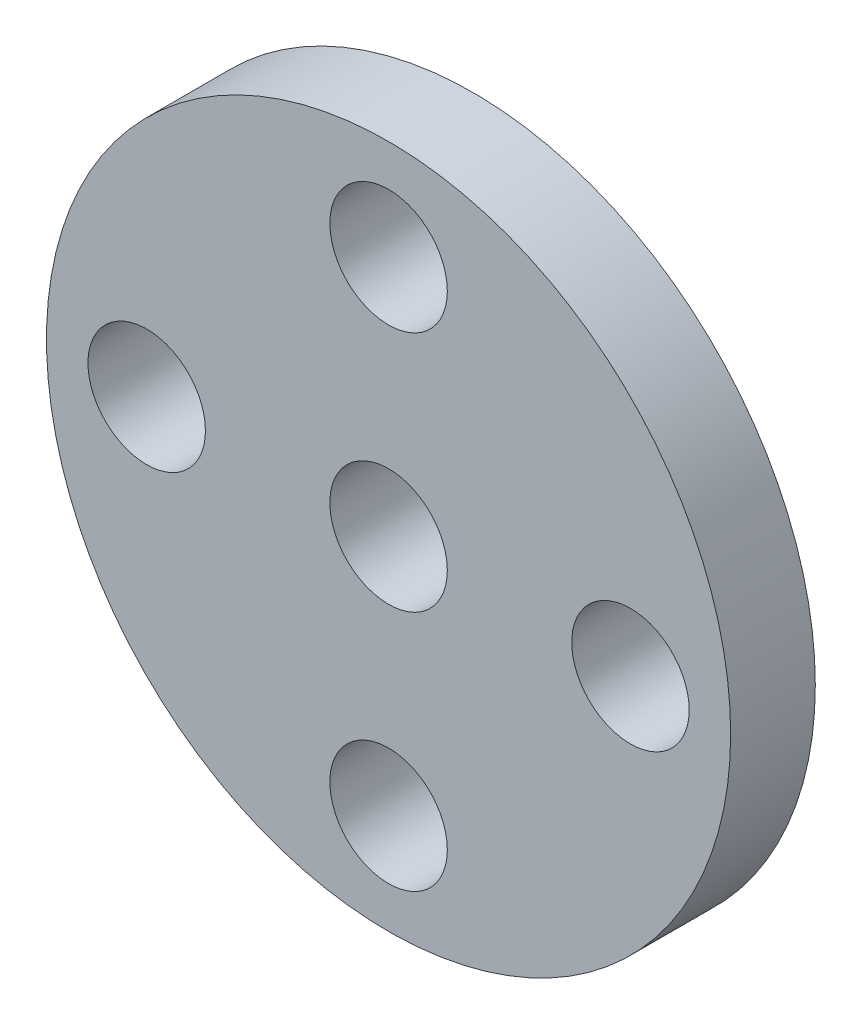
ISO-10303-21;
HEADER;
FILE_DESCRIPTION(('STEP AP214'),'2;1');
FILE_NAME('part.step','',(''),(''),'','','');
FILE_SCHEMA(('AUTOMOTIVE_DESIGN { 1 0 10303 214 1 1 1 1 }'));
ENDSEC;
DATA;
#1=APPLICATION_CONTEXT('core data for automotive mechanical design processes');
#2=APPLICATION_PROTOCOL_DEFINITION('international standard','automotive_design',2000,#1);
#3=PRODUCT_CONTEXT('',#1,'mechanical');
#4=PRODUCT('Part','Part','',(#3));
#5=PRODUCT_RELATED_PRODUCT_CATEGORY('part','',(#4));
#6=PRODUCT_DEFINITION_FORMATION('','',#4);
#7=PRODUCT_DEFINITION_CONTEXT('part definition',#1,'design');
#8=PRODUCT_DEFINITION('design','',#6,#7);
#9=PRODUCT_DEFINITION_SHAPE('','',#8);
#10=(LENGTH_UNIT() NAMED_UNIT(*) SI_UNIT(.MILLI.,.METRE.));
#11=(NAMED_UNIT(*) PLANE_ANGLE_UNIT() SI_UNIT($,.RADIAN.));
#12=(NAMED_UNIT(*) SI_UNIT($,.STERADIAN.) SOLID_ANGLE_UNIT());
#13=UNCERTAINTY_MEASURE_WITH_UNIT(LENGTH_MEASURE(1.E-05),#10,'distance_accuracy_value','');
#14=(GEOMETRIC_REPRESENTATION_CONTEXT(3) GLOBAL_UNCERTAINTY_ASSIGNED_CONTEXT((#13)) GLOBAL_UNIT_ASSIGNED_CONTEXT((#10,
#11,#12)) REPRESENTATION_CONTEXT('',''));
#15=CARTESIAN_POINT('',(0.,0.,0.));
#16=DIRECTION('',(0.,0.,1.));
#17=DIRECTION('',(1.,0.,0.));
#18=AXIS2_PLACEMENT_3D('',#15,#16,#17);
#19=CARTESIAN_POINT('',(0.,0.,-2.45));
#20=DIRECTION('',(0.,0.,1.));
#21=DIRECTION('',(1.,0.,0.));
#22=AXIS2_PLACEMENT_3D('',#19,#20,#21);
#23=PLANE('',#22);
#24=CARTESIAN_POINT('',(19.5,0.,-2.45));
#25=DIRECTION('',(0.,0.,1.));
#26=DIRECTION('',(1.,0.,0.));
#27=AXIS2_PLACEMENT_3D('',#24,#25,#26);
#28=CIRCLE('',#27,1.7);
#29=CARTESIAN_POINT('',(21.2,0.,-2.45));
#30=VERTEX_POINT('',#29);
#31=EDGE_CURVE('E41',#30,#30,#28,.T.);
#32=ORIENTED_EDGE('',*,*,#31,.T.);
#33=EDGE_LOOP('',(#32));
#34=FACE_BOUND('',#33,.T.);
#35=CARTESIAN_POINT('',(19.5,0.,-2.45));
#36=DIRECTION('',(0.,0.,-1.));
#37=DIRECTION('',(-1.,0.,0.));
#38=AXIS2_PLACEMENT_3D('',#35,#36,#37);
#39=CIRCLE('',#38,2.00641572465379);
#40=CARTESIAN_POINT('',(17.4935842753462,0.,-2.45));
#41=VERTEX_POINT('',#40);
#42=EDGE_CURVE('E163',#41,#41,#39,.T.);
#43=ORIENTED_EDGE('',*,*,#42,.T.);
#44=EDGE_LOOP('',(#43));
#45=FACE_BOUND('',#44,.T.);
#46=ADVANCED_FACE('F34',(#34,#45),#23,.F.);
#47=CARTESIAN_POINT('',(19.5,0.,-2.45));
#48=DIRECTION('',(0.,0.,1.));
#49=DIRECTION('',(1.,0.,0.));
#50=AXIS2_PLACEMENT_3D('',#47,#48,#49);
#51=CYLINDRICAL_SURFACE('',#50,9.9);
#52=CARTESIAN_POINT('',(19.5,0.,-2.45));
#53=DIRECTION('',(0.,0.,1.));
#54=DIRECTION('',(1.,0.,0.));
#55=AXIS2_PLACEMENT_3D('',#52,#53,#54);
#56=CIRCLE('',#55,9.9);
#57=CARTESIAN_POINT('',(29.4,0.,-2.45));
#58=VERTEX_POINT('',#57);
#59=EDGE_CURVE('E45',#58,#58,#56,.T.);
#60=ORIENTED_EDGE('',*,*,#59,.T.);
#61=EDGE_LOOP('',(#60));
#62=FACE_BOUND('',#61,.T.);
#63=CARTESIAN_POINT('',(19.5,0.,0.));
#64=DIRECTION('',(0.,0.,1.));
#65=DIRECTION('',(1.,0.,0.));
#66=AXIS2_PLACEMENT_3D('',#63,#64,#65);
#67=CIRCLE('',#66,9.9);
#68=CARTESIAN_POINT('',(29.4,0.,0.));
#69=VERTEX_POINT('',#68);
#70=EDGE_CURVE('E67',#69,#69,#67,.T.);
#71=ORIENTED_EDGE('',*,*,#70,.F.);
#72=EDGE_LOOP('',(#71));
#73=FACE_BOUND('',#72,.T.);
#74=ADVANCED_FACE('F96',(#62,#73),#51,.T.);
#75=CARTESIAN_POINT('',(19.5,7.,-2.45));
#76=DIRECTION('',(0.,0.,1.));
#77=DIRECTION('',(1.,0.,0.));
#78=AXIS2_PLACEMENT_3D('',#75,#76,#77);
#79=CYLINDRICAL_SURFACE('',#78,1.7);
#80=CARTESIAN_POINT('',(19.5,7.,-2.45));
#81=DIRECTION('',(0.,0.,1.));
#82=DIRECTION('',(1.,0.,0.));
#83=AXIS2_PLACEMENT_3D('',#80,#81,#82);
#84=CIRCLE('',#83,1.7);
#85=CARTESIAN_POINT('',(21.2,7.,-2.45));
#86=VERTEX_POINT('',#85);
#87=EDGE_CURVE('E50',#86,#86,#84,.T.);
#88=ORIENTED_EDGE('',*,*,#87,.F.);
#89=EDGE_LOOP('',(#88));
#90=FACE_BOUND('',#89,.T.);
#91=CARTESIAN_POINT('',(19.5,7.,0.));
#92=DIRECTION('',(0.,0.,1.));
#93=DIRECTION('',(1.,0.,0.));
#94=AXIS2_PLACEMENT_3D('',#91,#92,#93);
#95=CIRCLE('',#94,1.7);
#96=CARTESIAN_POINT('',(21.2,7.,0.));
#97=VERTEX_POINT('',#96);
#98=EDGE_CURVE('E64',#97,#97,#95,.T.);
#99=ORIENTED_EDGE('',*,*,#98,.T.);
#100=EDGE_LOOP('',(#99));
#101=FACE_BOUND('',#100,.T.);
#102=ADVANCED_FACE('F92',(#90,#101),#79,.F.);
#103=CARTESIAN_POINT('',(26.5,0.,-2.45));
#104=DIRECTION('',(0.,0.,1.));
#105=DIRECTION('',(1.,0.,0.));
#106=AXIS2_PLACEMENT_3D('',#103,#104,#105);
#107=CYLINDRICAL_SURFACE('',#106,1.7);
#108=CARTESIAN_POINT('',(26.5,0.,-2.45));
#109=DIRECTION('',(0.,0.,1.));
#110=DIRECTION('',(1.,0.,0.));
#111=AXIS2_PLACEMENT_3D('',#108,#109,#110);
#112=CIRCLE('',#111,1.7);
#113=CARTESIAN_POINT('',(28.2,0.,-2.45));
#114=VERTEX_POINT('',#113);
#115=EDGE_CURVE('E80',#114,#114,#112,.T.);
#116=ORIENTED_EDGE('',*,*,#115,.F.);
#117=EDGE_LOOP('',(#116));
#118=FACE_BOUND('',#117,.T.);
#119=CARTESIAN_POINT('',(26.5,0.,0.));
#120=DIRECTION('',(0.,0.,1.));
#121=DIRECTION('',(1.,0.,0.));
#122=AXIS2_PLACEMENT_3D('',#119,#120,#121);
#123=CIRCLE('',#122,1.7);
#124=CARTESIAN_POINT('',(28.2,0.,0.));
#125=VERTEX_POINT('',#124);
#126=EDGE_CURVE('E61',#125,#125,#123,.T.);
#127=ORIENTED_EDGE('',*,*,#126,.T.);
#128=EDGE_LOOP('',(#127));
#129=FACE_BOUND('',#128,.T.);
#130=ADVANCED_FACE('F95',(#118,#129),#107,.F.);
#131=CARTESIAN_POINT('',(19.4999999999999,-7.,-2.45));
#132=DIRECTION('',(0.,0.,1.));
#133=DIRECTION('',(1.,0.,0.));
#134=AXIS2_PLACEMENT_3D('',#131,#132,#133);
#135=CYLINDRICAL_SURFACE('',#134,1.7);
#136=CARTESIAN_POINT('',(19.4999999999999,-7.,-2.45));
#137=DIRECTION('',(0.,0.,1.));
#138=DIRECTION('',(1.,0.,0.));
#139=AXIS2_PLACEMENT_3D('',#136,#137,#138);
#140=CIRCLE('',#139,1.7);
#141=CARTESIAN_POINT('',(21.1999999999999,-7.,-2.45));
#142=VERTEX_POINT('',#141);
#143=EDGE_CURVE('E75',#142,#142,#140,.T.);
#144=ORIENTED_EDGE('',*,*,#143,.F.);
#145=EDGE_LOOP('',(#144));
#146=FACE_BOUND('',#145,.T.);
#147=CARTESIAN_POINT('',(19.4999999999999,-7.,0.));
#148=DIRECTION('',(0.,0.,1.));
#149=DIRECTION('',(1.,0.,0.));
#150=AXIS2_PLACEMENT_3D('',#147,#148,#149);
#151=CIRCLE('',#150,1.7);
#152=CARTESIAN_POINT('',(21.1999999999999,-7.,0.));
#153=VERTEX_POINT('',#152);
#154=EDGE_CURVE('E57',#153,#153,#151,.T.);
#155=ORIENTED_EDGE('',*,*,#154,.T.);
#156=EDGE_LOOP('',(#155));
#157=FACE_BOUND('',#156,.T.);
#158=ADVANCED_FACE('F120',(#146,#157),#135,.F.);
#159=CARTESIAN_POINT('',(12.5,0.,-2.45));
#160=DIRECTION('',(0.,0.,1.));
#161=DIRECTION('',(1.,0.,0.));
#162=AXIS2_PLACEMENT_3D('',#159,#160,#161);
#163=CYLINDRICAL_SURFACE('',#162,1.7);
#164=CARTESIAN_POINT('',(12.5,0.,-2.45));
#165=DIRECTION('',(0.,0.,1.));
#166=DIRECTION('',(1.,0.,0.));
#167=AXIS2_PLACEMENT_3D('',#164,#165,#166);
#168=CIRCLE('',#167,1.7);
#169=CARTESIAN_POINT('',(14.2,0.,-2.45));
#170=VERTEX_POINT('',#169);
#171=EDGE_CURVE('E71',#170,#170,#168,.T.);
#172=ORIENTED_EDGE('',*,*,#171,.F.);
#173=EDGE_LOOP('',(#172));
#174=FACE_BOUND('',#173,.T.);
#175=CARTESIAN_POINT('',(12.5,0.,0.));
#176=DIRECTION('',(0.,0.,1.));
#177=DIRECTION('',(1.,0.,0.));
#178=AXIS2_PLACEMENT_3D('',#175,#176,#177);
#179=CIRCLE('',#178,1.7);
#180=CARTESIAN_POINT('',(14.2,0.,0.));
#181=VERTEX_POINT('',#180);
#182=EDGE_CURVE('E54',#181,#181,#179,.T.);
#183=ORIENTED_EDGE('',*,*,#182,.T.);
#184=EDGE_LOOP('',(#183));
#185=FACE_BOUND('',#184,.T.);
#186=ADVANCED_FACE('F36',(#174,#185),#163,.F.);
#187=CARTESIAN_POINT('',(19.5,0.,-2.45));
#188=DIRECTION('',(0.,0.,1.));
#189=DIRECTION('',(1.,0.,0.));
#190=AXIS2_PLACEMENT_3D('',#187,#188,#189);
#191=CYLINDRICAL_SURFACE('',#190,1.7);
#192=ORIENTED_EDGE('',*,*,#31,.F.);
#193=EDGE_LOOP('',(#192));
#194=FACE_BOUND('',#193,.T.);
#195=CARTESIAN_POINT('',(19.5,0.,0.));
#196=DIRECTION('',(0.,0.,1.));
#197=DIRECTION('',(1.,0.,0.));
#198=AXIS2_PLACEMENT_3D('',#195,#196,#197);
#199=CIRCLE('',#198,1.7);
#200=CARTESIAN_POINT('',(21.2,0.,0.));
#201=VERTEX_POINT('',#200);
#202=EDGE_CURVE('E69',#201,#201,#199,.T.);
#203=ORIENTED_EDGE('',*,*,#202,.T.);
#204=EDGE_LOOP('',(#203));
#205=FACE_BOUND('',#204,.T.);
#206=ADVANCED_FACE('F117',(#194,#205),#191,.F.);
#207=CARTESIAN_POINT('',(19.5,0.,-2.45));
#208=DIRECTION('',(0.,0.,1.));
#209=DIRECTION('',(1.,0.,0.));
#210=AXIS2_PLACEMENT_3D('',#207,#208,#209);
#211=CIRCLE('',#210,4.5);
#212=CARTESIAN_POINT('',(24.,0.,-2.45));
#213=VERTEX_POINT('',#212);
#214=EDGE_CURVE('E10',#213,#213,#211,.F.);
#215=ORIENTED_EDGE('',*,*,#214,.F.);
#216=EDGE_LOOP('',(#215));
#217=FACE_BOUND('',#216,.T.);
#218=ORIENTED_EDGE('',*,*,#171,.T.);
#219=EDGE_LOOP('',(#218));
#220=FACE_BOUND('',#219,.T.);
#221=ORIENTED_EDGE('',*,*,#143,.T.);
#222=EDGE_LOOP('',(#221));
#223=FACE_BOUND('',#222,.T.);
#224=ORIENTED_EDGE('',*,*,#115,.T.);
#225=EDGE_LOOP('',(#224));
#226=FACE_BOUND('',#225,.T.);
#227=ORIENTED_EDGE('',*,*,#87,.T.);
#228=EDGE_LOOP('',(#227));
#229=FACE_BOUND('',#228,.T.);
#230=ORIENTED_EDGE('',*,*,#59,.F.);
#231=EDGE_LOOP('',(#230));
#232=FACE_BOUND('',#231,.T.);
#233=ADVANCED_FACE('F89',(#217,#220,#223,#226,#229,#232),#23,.F.);
#234=CARTESIAN_POINT('',(0.,0.,0.));
#235=DIRECTION('',(0.,0.,1.));
#236=DIRECTION('',(1.,0.,0.));
#237=AXIS2_PLACEMENT_3D('',#234,#235,#236);
#238=PLANE('',#237);
#239=ORIENTED_EDGE('',*,*,#182,.F.);
#240=EDGE_LOOP('',(#239));
#241=FACE_BOUND('',#240,.T.);
#242=ORIENTED_EDGE('',*,*,#154,.F.);
#243=EDGE_LOOP('',(#242));
#244=FACE_BOUND('',#243,.T.);
#245=ORIENTED_EDGE('',*,*,#126,.F.);
#246=EDGE_LOOP('',(#245));
#247=FACE_BOUND('',#246,.T.);
#248=ORIENTED_EDGE('',*,*,#98,.F.);
#249=EDGE_LOOP('',(#248));
#250=FACE_BOUND('',#249,.T.);
#251=ORIENTED_EDGE('',*,*,#70,.T.);
#252=EDGE_LOOP('',(#251));
#253=FACE_BOUND('',#252,.T.);
#254=ORIENTED_EDGE('',*,*,#202,.F.);
#255=EDGE_LOOP('',(#254));
#256=FACE_BOUND('',#255,.T.);
#257=ADVANCED_FACE('F100',(#241,#244,#247,#250,#253,#256),#238,.T.);
#258=CARTESIAN_POINT('',(19.5,0.,-4.5));
#259=DIRECTION('',(0.,0.,-1.));
#260=DIRECTION('',(-1.,0.,0.));
#261=AXIS2_PLACEMENT_3D('',#258,#259,#260);
#262=PLANE('',#261);
#263=CARTESIAN_POINT('',(19.5,0.,-4.5));
#264=DIRECTION('',(0.,0.,-1.));
#265=DIRECTION('',(-1.,0.,0.));
#266=AXIS2_PLACEMENT_3D('',#263,#264,#265);
#267=CIRCLE('',#266,4.5);
#268=CARTESIAN_POINT('',(15.,0.,-4.5));
#269=VERTEX_POINT('',#268);
#270=EDGE_CURVE('E58',#269,#269,#267,.T.);
#271=ORIENTED_EDGE('',*,*,#270,.T.);
#272=EDGE_LOOP('',(#271));
#273=FACE_BOUND('',#272,.T.);
#274=CARTESIAN_POINT('',(19.5,0.,-4.5));
#275=DIRECTION('',(0.,0.,-1.));
#276=DIRECTION('',(-1.,0.,0.));
#277=AXIS2_PLACEMENT_3D('',#274,#275,#276);
#278=CIRCLE('',#277,2.00641572465379);
#279=CARTESIAN_POINT('',(17.4935842753462,0.,-4.5));
#280=VERTEX_POINT('',#279);
#281=EDGE_CURVE('E160',#280,#280,#278,.T.);
#282=ORIENTED_EDGE('',*,*,#281,.F.);
#283=EDGE_LOOP('',(#282));
#284=FACE_BOUND('',#283,.T.);
#285=ADVANCED_FACE('F103',(#273,#284),#262,.T.);
#286=CARTESIAN_POINT('',(19.5,0.,-4.5));
#287=DIRECTION('',(0.,0.,1.));
#288=DIRECTION('',(1.,0.,0.));
#289=AXIS2_PLACEMENT_3D('',#286,#287,#288);
#290=CYLINDRICAL_SURFACE('',#289,4.5);
#291=ORIENTED_EDGE('',*,*,#270,.F.);
#292=EDGE_LOOP('',(#291));
#293=FACE_BOUND('',#292,.T.);
#294=ORIENTED_EDGE('',*,*,#214,.T.);
#295=EDGE_LOOP('',(#294));
#296=FACE_BOUND('',#295,.T.);
#297=ADVANCED_FACE('F145',(#293,#296),#290,.T.);
#298=CARTESIAN_POINT('',(19.5,0.,-4.5));
#299=DIRECTION('',(0.,0.,1.));
#300=DIRECTION('',(1.,0.,0.));
#301=AXIS2_PLACEMENT_3D('',#298,#299,#300);
#302=CYLINDRICAL_SURFACE('',#301,2.00641572465379);
#303=ORIENTED_EDGE('',*,*,#281,.T.);
#304=EDGE_LOOP('',(#303));
#305=FACE_BOUND('',#304,.T.);
#306=ORIENTED_EDGE('',*,*,#42,.F.);
#307=EDGE_LOOP('',(#306));
#308=FACE_BOUND('',#307,.T.);
#309=ADVANCED_FACE('F148',(#305,#308),#302,.F.);
#310=CLOSED_SHELL('',(#46,#74,#102,#130,#158,#186,#206,#233,#257,#285,#297,#309));
#311=MANIFOLD_SOLID_BREP('B2',#310);
#312=ADVANCED_BREP_SHAPE_REPRESENTATION('',(#18,#311),#14);
#313=SHAPE_DEFINITION_REPRESENTATION(#9,#312);
ENDSEC;
END-ISO-10303-21;
